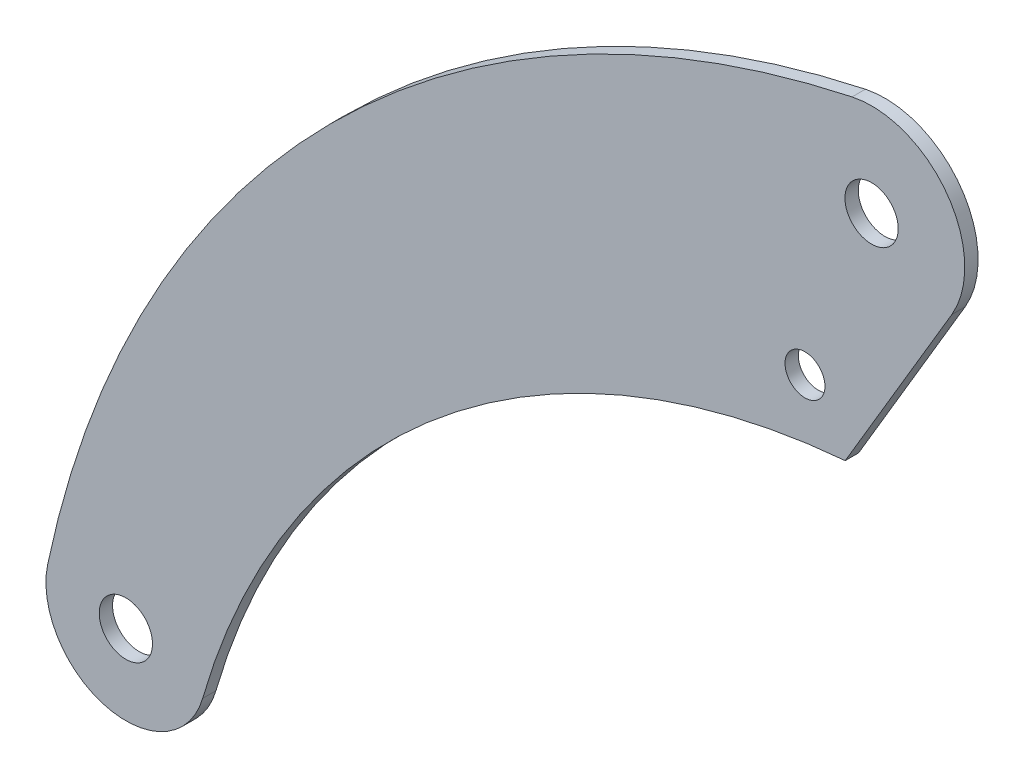
ISO-10303-21;
HEADER;
FILE_DESCRIPTION(('STEP AP214'),'2;1');
FILE_NAME('part.step','',(''),(''),'','','');
FILE_SCHEMA(('AUTOMOTIVE_DESIGN { 1 0 10303 214 1 1 1 1 }'));
ENDSEC;
DATA;
#1=APPLICATION_CONTEXT('core data for automotive mechanical design processes');
#2=APPLICATION_PROTOCOL_DEFINITION('international standard','automotive_design',2000,#1);
#3=PRODUCT_CONTEXT('',#1,'mechanical');
#4=PRODUCT('Part','Part','',(#3));
#5=PRODUCT_RELATED_PRODUCT_CATEGORY('part','',(#4));
#6=PRODUCT_DEFINITION_FORMATION('','',#4);
#7=PRODUCT_DEFINITION_CONTEXT('part definition',#1,'design');
#8=PRODUCT_DEFINITION('design','',#6,#7);
#9=PRODUCT_DEFINITION_SHAPE('','',#8);
#10=(LENGTH_UNIT() NAMED_UNIT(*) SI_UNIT(.MILLI.,.METRE.));
#11=(NAMED_UNIT(*) PLANE_ANGLE_UNIT() SI_UNIT($,.RADIAN.));
#12=(NAMED_UNIT(*) SI_UNIT($,.STERADIAN.) SOLID_ANGLE_UNIT());
#13=UNCERTAINTY_MEASURE_WITH_UNIT(LENGTH_MEASURE(1.E-05),#10,'distance_accuracy_value','');
#14=(GEOMETRIC_REPRESENTATION_CONTEXT(3) GLOBAL_UNCERTAINTY_ASSIGNED_CONTEXT((#13)) GLOBAL_UNIT_ASSIGNED_CONTEXT((#10,
#11,#12)) REPRESENTATION_CONTEXT('',''));
#15=CARTESIAN_POINT('',(0.,0.,0.));
#16=DIRECTION('',(0.,0.,1.));
#17=DIRECTION('',(1.,0.,0.));
#18=AXIS2_PLACEMENT_3D('',#15,#16,#17);
#19=CARTESIAN_POINT('',(149.481823007681,-699.199674335093,5.));
#20=DIRECTION('',(0.,0.,1.));
#21=DIRECTION('',(1.,0.,0.));
#22=AXIS2_PLACEMENT_3D('',#19,#20,#21);
#23=PLANE('',#22);
#24=CARTESIAN_POINT('',(-50.,-130.,5.));
#25=DIRECTION('',(0.,0.,1.));
#26=DIRECTION('',(1.,0.,0.));
#27=AXIS2_PLACEMENT_3D('',#24,#25,#26);
#28=CIRCLE('',#27,15.);
#29=CARTESIAN_POINT('',(-35.,-130.,5.));
#30=VERTEX_POINT('',#29);
#31=EDGE_CURVE('E192',#30,#30,#28,.T.);
#32=ORIENTED_EDGE('',*,*,#31,.F.);
#33=EDGE_LOOP('',(#32));
#34=FACE_BOUND('',#33,.T.);
#35=CARTESIAN_POINT('',(149.481823007681,-699.199674335093,5.));
#36=DIRECTION('',(0.,0.,1.));
#37=DIRECTION('',(1.,0.,0.));
#38=AXIS2_PLACEMENT_3D('',#35,#36,#37);
#39=CIRCLE('',#38,785.);
#40=CARTESIAN_POINT('',(-14.6345840706821,68.4531149698693,5.));
#41=VERTEX_POINT('',#40);
#42=CARTESIAN_POINT('',(-618.715737076498,-537.652440744682,5.));
#43=VERTEX_POINT('',#42);
#44=EDGE_CURVE('E137',#41,#43,#39,.T.);
#45=ORIENTED_EDGE('',*,*,#44,.T.);
#46=CARTESIAN_POINT('',(-560.,-550.,5.));
#47=DIRECTION('',(0.,0.,1.));
#48=DIRECTION('',(1.,0.,0.));
#49=AXIS2_PLACEMENT_3D('',#46,#47,#48);
#50=CIRCLE('',#49,59.9999999999999);
#51=CARTESIAN_POINT('',(-502.341900982989,-566.599506551236,5.));
#52=VERTEX_POINT('',#51);
#53=EDGE_CURVE('E95',#43,#52,#50,.T.);
#54=ORIENTED_EDGE('',*,*,#53,.T.);
#55=CARTESIAN_POINT('',(26.1906733396146,-718.761649937565,5.));
#56=DIRECTION('',(0.,0.,-1.));
#57=DIRECTION('',(1.,0.,0.));
#58=AXIS2_PLACEMENT_3D('',#55,#56,#57);
#59=CIRCLE('',#58,550.);
#60=CARTESIAN_POINT('',(-19.7795926456078,-170.686167321121,5.));
#61=VERTEX_POINT('',#60);
#62=EDGE_CURVE('E99',#52,#61,#59,.T.);
#63=ORIENTED_EDGE('',*,*,#62,.T.);
#64=DIRECTION('',(0.509802390301733,0.860291533634175,0.));
#65=VECTOR('',#64,1.);
#66=CARTESIAN_POINT('',(60.2204073543922,-35.6861673211213,5.));
#67=LINE('',#66,#65);
#68=CARTESIAN_POINT('',(60.2204073543922,-35.6861673211213,5.));
#69=VERTEX_POINT('',#68);
#70=EDGE_CURVE('E103',#61,#69,#67,.T.);
#71=ORIENTED_EDGE('',*,*,#70,.T.);
#72=CARTESIAN_POINT('',(0.,0.,5.));
#73=DIRECTION('',(0.,0.,1.));
#74=DIRECTION('',(-1.,0.,0.));
#75=AXIS2_PLACEMENT_3D('',#72,#73,#74);
#76=CIRCLE('',#75,70.);
#77=EDGE_CURVE('E61',#69,#41,#76,.T.);
#78=ORIENTED_EDGE('',*,*,#77,.T.);
#79=EDGE_LOOP('',(#45,#54,#63,#71,#78));
#80=FACE_BOUND('',#79,.T.);
#81=CARTESIAN_POINT('',(0.,0.,5.));
#82=DIRECTION('',(0.,0.,1.));
#83=DIRECTION('',(1.,0.,0.));
#84=AXIS2_PLACEMENT_3D('',#81,#82,#83);
#85=CIRCLE('',#84,20.);
#86=CARTESIAN_POINT('',(20.,0.,5.));
#87=VERTEX_POINT('',#86);
#88=EDGE_CURVE('E128',#87,#87,#85,.T.);
#89=ORIENTED_EDGE('',*,*,#88,.F.);
#90=EDGE_LOOP('',(#89));
#91=FACE_BOUND('',#90,.T.);
#92=CARTESIAN_POINT('',(-560.,-550.,5.));
#93=DIRECTION('',(0.,0.,1.));
#94=DIRECTION('',(1.,0.,0.));
#95=AXIS2_PLACEMENT_3D('',#92,#93,#94);
#96=CIRCLE('',#95,20.);
#97=CARTESIAN_POINT('',(-540.,-550.,5.));
#98=VERTEX_POINT('',#97);
#99=EDGE_CURVE('E181',#98,#98,#96,.T.);
#100=ORIENTED_EDGE('',*,*,#99,.F.);
#101=EDGE_LOOP('',(#100));
#102=FACE_BOUND('',#101,.T.);
#103=ADVANCED_FACE('F43',(#34,#80,#91,#102),#23,.T.);
#104=CARTESIAN_POINT('',(149.481823007681,-699.199674335093,-5.));
#105=DIRECTION('',(0.,0.,1.));
#106=DIRECTION('',(1.,0.,0.));
#107=AXIS2_PLACEMENT_3D('',#104,#105,#106);
#108=PLANE('',#107);
#109=CARTESIAN_POINT('',(149.481823007681,-699.199674335093,-5.));
#110=DIRECTION('',(0.,0.,1.));
#111=DIRECTION('',(1.,0.,0.));
#112=AXIS2_PLACEMENT_3D('',#109,#110,#111);
#113=CIRCLE('',#112,785.);
#114=CARTESIAN_POINT('',(-14.6345840706821,68.4531149698693,-5.));
#115=VERTEX_POINT('',#114);
#116=CARTESIAN_POINT('',(-618.715737076498,-537.652440744682,-5.));
#117=VERTEX_POINT('',#116);
#118=EDGE_CURVE('E123',#115,#117,#113,.T.);
#119=ORIENTED_EDGE('',*,*,#118,.F.);
#120=CARTESIAN_POINT('',(0.,0.,-5.));
#121=DIRECTION('',(0.,0.,1.));
#122=DIRECTION('',(-1.,0.,0.));
#123=AXIS2_PLACEMENT_3D('',#120,#121,#122);
#124=CIRCLE('',#123,70.);
#125=CARTESIAN_POINT('',(60.2204073543922,-35.6861673211213,-5.));
#126=VERTEX_POINT('',#125);
#127=EDGE_CURVE('E87',#126,#115,#124,.T.);
#128=ORIENTED_EDGE('',*,*,#127,.F.);
#129=DIRECTION('',(0.509802390301733,0.860291533634175,0.));
#130=VECTOR('',#129,1.);
#131=CARTESIAN_POINT('',(60.2204073543922,-35.6861673211213,-5.));
#132=LINE('',#131,#130);
#133=CARTESIAN_POINT('',(-19.7795926456078,-170.686167321121,-5.));
#134=VERTEX_POINT('',#133);
#135=EDGE_CURVE('E81',#134,#126,#132,.T.);
#136=ORIENTED_EDGE('',*,*,#135,.F.);
#137=CARTESIAN_POINT('',(26.1906733396146,-718.761649937565,-5.));
#138=DIRECTION('',(0.,0.,-1.));
#139=DIRECTION('',(1.,0.,0.));
#140=AXIS2_PLACEMENT_3D('',#137,#138,#139);
#141=CIRCLE('',#140,550.);
#142=CARTESIAN_POINT('',(-502.341900982989,-566.599506551236,-5.));
#143=VERTEX_POINT('',#142);
#144=EDGE_CURVE('E111',#143,#134,#141,.T.);
#145=ORIENTED_EDGE('',*,*,#144,.F.);
#146=CARTESIAN_POINT('',(-560.,-550.,-5.));
#147=DIRECTION('',(0.,0.,1.));
#148=DIRECTION('',(1.,0.,0.));
#149=AXIS2_PLACEMENT_3D('',#146,#147,#148);
#150=CIRCLE('',#149,59.9999999999999);
#151=EDGE_CURVE('E127',#117,#143,#150,.T.);
#152=ORIENTED_EDGE('',*,*,#151,.F.);
#153=EDGE_LOOP('',(#119,#128,#136,#145,#152));
#154=FACE_BOUND('',#153,.T.);
#155=CARTESIAN_POINT('',(0.,0.,-5.));
#156=DIRECTION('',(0.,0.,1.));
#157=DIRECTION('',(1.,0.,0.));
#158=AXIS2_PLACEMENT_3D('',#155,#156,#157);
#159=CIRCLE('',#158,20.);
#160=CARTESIAN_POINT('',(20.,0.,-5.));
#161=VERTEX_POINT('',#160);
#162=EDGE_CURVE('E196',#161,#161,#159,.T.);
#163=ORIENTED_EDGE('',*,*,#162,.T.);
#164=EDGE_LOOP('',(#163));
#165=FACE_BOUND('',#164,.T.);
#166=CARTESIAN_POINT('',(-50.,-130.,-5.));
#167=DIRECTION('',(0.,0.,1.));
#168=DIRECTION('',(1.,0.,0.));
#169=AXIS2_PLACEMENT_3D('',#166,#167,#168);
#170=CIRCLE('',#169,15.);
#171=CARTESIAN_POINT('',(-35.,-130.,-5.));
#172=VERTEX_POINT('',#171);
#173=EDGE_CURVE('E189',#172,#172,#170,.T.);
#174=ORIENTED_EDGE('',*,*,#173,.T.);
#175=EDGE_LOOP('',(#174));
#176=FACE_BOUND('',#175,.T.);
#177=CARTESIAN_POINT('',(-560.,-550.,-5.));
#178=DIRECTION('',(0.,0.,1.));
#179=DIRECTION('',(1.,0.,0.));
#180=AXIS2_PLACEMENT_3D('',#177,#178,#179);
#181=CIRCLE('',#180,20.);
#182=CARTESIAN_POINT('',(-540.,-550.,-5.));
#183=VERTEX_POINT('',#182);
#184=EDGE_CURVE('E184',#183,#183,#181,.T.);
#185=ORIENTED_EDGE('',*,*,#184,.T.);
#186=EDGE_LOOP('',(#185));
#187=FACE_BOUND('',#186,.T.);
#188=ADVANCED_FACE('F144',(#154,#165,#176,#187),#108,.F.);
#189=CARTESIAN_POINT('',(149.481823007681,-699.199674335093,5.));
#190=DIRECTION('',(0.,0.,-1.));
#191=DIRECTION('',(-1.,0.,0.));
#192=AXIS2_PLACEMENT_3D('',#189,#190,#191);
#193=CYLINDRICAL_SURFACE('',#192,785.);
#194=ORIENTED_EDGE('',*,*,#118,.T.);
#195=DIRECTION('',(0.,0.,-1.));
#196=VECTOR('',#195,1.);
#197=CARTESIAN_POINT('',(-618.715737076498,-537.652440744682,5.));
#198=LINE('',#197,#196);
#199=EDGE_CURVE('E11',#43,#117,#198,.T.);
#200=ORIENTED_EDGE('',*,*,#199,.F.);
#201=ORIENTED_EDGE('',*,*,#44,.F.);
#202=DIRECTION('',(0.,0.,-1.));
#203=VECTOR('',#202,1.);
#204=CARTESIAN_POINT('',(-14.6345840706821,68.4531149698693,5.));
#205=LINE('',#204,#203);
#206=EDGE_CURVE('E119',#41,#115,#205,.T.);
#207=ORIENTED_EDGE('',*,*,#206,.T.);
#208=EDGE_LOOP('',(#194,#200,#201,#207));
#209=FACE_BOUND('',#208,.T.);
#210=ADVANCED_FACE('F45',(#209),#193,.T.);
#211=CARTESIAN_POINT('',(-560.,-550.,5.));
#212=DIRECTION('',(0.,0.,-1.));
#213=DIRECTION('',(-1.,0.,0.));
#214=AXIS2_PLACEMENT_3D('',#211,#212,#213);
#215=CYLINDRICAL_SURFACE('',#214,59.9999999999999);
#216=ORIENTED_EDGE('',*,*,#151,.T.);
#217=DIRECTION('',(0.,0.,-1.));
#218=VECTOR('',#217,1.);
#219=CARTESIAN_POINT('',(-502.341900982989,-566.599506551236,5.));
#220=LINE('',#219,#218);
#221=EDGE_CURVE('E53',#52,#143,#220,.T.);
#222=ORIENTED_EDGE('',*,*,#221,.F.);
#223=ORIENTED_EDGE('',*,*,#53,.F.);
#224=ORIENTED_EDGE('',*,*,#199,.T.);
#225=EDGE_LOOP('',(#216,#222,#223,#224));
#226=FACE_BOUND('',#225,.T.);
#227=ADVANCED_FACE('F245',(#226),#215,.T.);
#228=CARTESIAN_POINT('',(26.1906733396146,-718.761649937565,5.));
#229=DIRECTION('',(0.,0.,-1.));
#230=DIRECTION('',(-1.,0.,0.));
#231=AXIS2_PLACEMENT_3D('',#228,#229,#230);
#232=CYLINDRICAL_SURFACE('',#231,550.);
#233=ORIENTED_EDGE('',*,*,#144,.T.);
#234=DIRECTION('',(0.,0.,-1.));
#235=VECTOR('',#234,1.);
#236=CARTESIAN_POINT('',(-19.7795926456078,-170.686167321121,5.));
#237=LINE('',#236,#235);
#238=EDGE_CURVE('E108',#61,#134,#237,.T.);
#239=ORIENTED_EDGE('',*,*,#238,.F.);
#240=ORIENTED_EDGE('',*,*,#62,.F.);
#241=ORIENTED_EDGE('',*,*,#221,.T.);
#242=EDGE_LOOP('',(#233,#239,#240,#241));
#243=FACE_BOUND('',#242,.T.);
#244=ADVANCED_FACE('F109',(#243),#232,.F.);
#245=CARTESIAN_POINT('',(60.2204073543922,-35.6861673211213,5.));
#246=DIRECTION('',(-0.860291533634175,0.509802390301733,0.));
#247=DIRECTION('',(-0.509802390301733,-0.860291533634175,0.));
#248=AXIS2_PLACEMENT_3D('',#245,#246,#247);
#249=PLANE('',#248);
#250=ORIENTED_EDGE('',*,*,#135,.T.);
#251=DIRECTION('',(0.,0.,-1.));
#252=VECTOR('',#251,1.);
#253=CARTESIAN_POINT('',(60.2204073543922,-35.6861673211213,5.));
#254=LINE('',#253,#252);
#255=EDGE_CURVE('E113',#69,#126,#254,.T.);
#256=ORIENTED_EDGE('',*,*,#255,.F.);
#257=ORIENTED_EDGE('',*,*,#70,.F.);
#258=ORIENTED_EDGE('',*,*,#238,.T.);
#259=EDGE_LOOP('',(#250,#256,#257,#258));
#260=FACE_BOUND('',#259,.T.);
#261=ADVANCED_FACE('F115',(#260),#249,.F.);
#262=CARTESIAN_POINT('',(0.,0.,5.));
#263=DIRECTION('',(0.,0.,-1.));
#264=DIRECTION('',(-1.,0.,0.));
#265=AXIS2_PLACEMENT_3D('',#262,#263,#264);
#266=CYLINDRICAL_SURFACE('',#265,70.);
#267=ORIENTED_EDGE('',*,*,#127,.T.);
#268=ORIENTED_EDGE('',*,*,#206,.F.);
#269=ORIENTED_EDGE('',*,*,#77,.F.);
#270=ORIENTED_EDGE('',*,*,#255,.T.);
#271=EDGE_LOOP('',(#267,#268,#269,#270));
#272=FACE_BOUND('',#271,.T.);
#273=ADVANCED_FACE('F149',(#272),#266,.T.);
#274=CARTESIAN_POINT('',(0.,0.,5.));
#275=DIRECTION('',(0.,0.,-1.));
#276=DIRECTION('',(-1.,0.,0.));
#277=AXIS2_PLACEMENT_3D('',#274,#275,#276);
#278=CYLINDRICAL_SURFACE('',#277,20.);
#279=ORIENTED_EDGE('',*,*,#88,.T.);
#280=EDGE_LOOP('',(#279));
#281=FACE_BOUND('',#280,.T.);
#282=ORIENTED_EDGE('',*,*,#162,.F.);
#283=EDGE_LOOP('',(#282));
#284=FACE_BOUND('',#283,.T.);
#285=ADVANCED_FACE('F151',(#281,#284),#278,.F.);
#286=CARTESIAN_POINT('',(-50.,-130.,5.));
#287=DIRECTION('',(0.,0.,-1.));
#288=DIRECTION('',(-1.,0.,0.));
#289=AXIS2_PLACEMENT_3D('',#286,#287,#288);
#290=CYLINDRICAL_SURFACE('',#289,15.);
#291=ORIENTED_EDGE('',*,*,#31,.T.);
#292=EDGE_LOOP('',(#291));
#293=FACE_BOUND('',#292,.T.);
#294=ORIENTED_EDGE('',*,*,#173,.F.);
#295=EDGE_LOOP('',(#294));
#296=FACE_BOUND('',#295,.T.);
#297=ADVANCED_FACE('F157',(#293,#296),#290,.F.);
#298=CARTESIAN_POINT('',(-560.,-550.,5.));
#299=DIRECTION('',(0.,0.,-1.));
#300=DIRECTION('',(-1.,0.,0.));
#301=AXIS2_PLACEMENT_3D('',#298,#299,#300);
#302=CYLINDRICAL_SURFACE('',#301,20.);
#303=ORIENTED_EDGE('',*,*,#99,.T.);
#304=EDGE_LOOP('',(#303));
#305=FACE_BOUND('',#304,.T.);
#306=ORIENTED_EDGE('',*,*,#184,.F.);
#307=EDGE_LOOP('',(#306));
#308=FACE_BOUND('',#307,.T.);
#309=ADVANCED_FACE('F172',(#305,#308),#302,.F.);
#310=CLOSED_SHELL('',(#103,#188,#210,#227,#244,#261,#273,#285,#297,#309));
#311=MANIFOLD_SOLID_BREP('B2',#310);
#312=ADVANCED_BREP_SHAPE_REPRESENTATION('',(#18,#311),#14);
#313=SHAPE_DEFINITION_REPRESENTATION(#9,#312);
ENDSEC;
END-ISO-10303-21;
